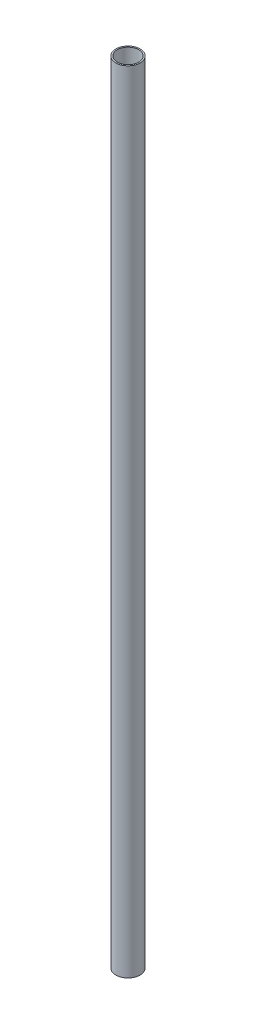
ISO-10303-21;
HEADER;
FILE_DESCRIPTION(('STEP AP214'),'2;1');
FILE_NAME('part.step','',(''),(''),'','','');
FILE_SCHEMA(('AUTOMOTIVE_DESIGN { 1 0 10303 214 1 1 1 1 }'));
ENDSEC;
DATA;
#1=APPLICATION_CONTEXT('core data for automotive mechanical design processes');
#2=APPLICATION_PROTOCOL_DEFINITION('international standard','automotive_design',2000,#1);
#3=PRODUCT_CONTEXT('',#1,'mechanical');
#4=PRODUCT('Part','Part','',(#3));
#5=PRODUCT_RELATED_PRODUCT_CATEGORY('part','',(#4));
#6=PRODUCT_DEFINITION_FORMATION('','',#4);
#7=PRODUCT_DEFINITION_CONTEXT('part definition',#1,'design');
#8=PRODUCT_DEFINITION('design','',#6,#7);
#9=PRODUCT_DEFINITION_SHAPE('','',#8);
#10=(LENGTH_UNIT() NAMED_UNIT(*) SI_UNIT(.MILLI.,.METRE.));
#11=(NAMED_UNIT(*) PLANE_ANGLE_UNIT() SI_UNIT($,.RADIAN.));
#12=(NAMED_UNIT(*) SI_UNIT($,.STERADIAN.) SOLID_ANGLE_UNIT());
#13=UNCERTAINTY_MEASURE_WITH_UNIT(LENGTH_MEASURE(1.E-05),#10,'distance_accuracy_value','');
#14=(GEOMETRIC_REPRESENTATION_CONTEXT(3) GLOBAL_UNCERTAINTY_ASSIGNED_CONTEXT((#13)) GLOBAL_UNIT_ASSIGNED_CONTEXT((#10,
#11,#12)) REPRESENTATION_CONTEXT('',''));
#15=CARTESIAN_POINT('',(0.,0.,0.));
#16=DIRECTION('',(0.,0.,1.));
#17=DIRECTION('',(1.,0.,0.));
#18=AXIS2_PLACEMENT_3D('',#15,#16,#17);
#19=CARTESIAN_POINT('',(0.,1300.,0.));
#20=DIRECTION('',(0.,1.,0.));
#21=DIRECTION('',(0.,0.,1.));
#22=AXIS2_PLACEMENT_3D('',#19,#20,#21);
#23=PLANE('',#22);
#24=CARTESIAN_POINT('',(0.,1300.,0.));
#25=DIRECTION('',(0.,1.,0.));
#26=DIRECTION('',(0.,0.,1.));
#27=AXIS2_PLACEMENT_3D('',#24,#25,#26);
#28=CIRCLE('',#27,20.);
#29=CARTESIAN_POINT('',(0.,1300.,20.));
#30=VERTEX_POINT('',#29);
#31=EDGE_CURVE('E10',#30,#30,#28,.T.);
#32=ORIENTED_EDGE('',*,*,#31,.T.);
#33=EDGE_LOOP('',(#32));
#34=FACE_BOUND('',#33,.T.);
#35=CARTESIAN_POINT('',(0.,1300.,0.));
#36=DIRECTION('',(0.,1.,0.));
#37=DIRECTION('',(0.,0.,1.));
#38=AXIS2_PLACEMENT_3D('',#35,#36,#37);
#39=CIRCLE('',#38,17.7);
#40=CARTESIAN_POINT('',(0.,1300.,17.7));
#41=VERTEX_POINT('',#40);
#42=EDGE_CURVE('E47',#41,#41,#39,.T.);
#43=ORIENTED_EDGE('',*,*,#42,.F.);
#44=EDGE_LOOP('',(#43));
#45=FACE_BOUND('',#44,.T.);
#46=ADVANCED_FACE('F36',(#34,#45),#23,.T.);
#47=CARTESIAN_POINT('',(0.,0.,0.));
#48=DIRECTION('',(0.,1.,0.));
#49=DIRECTION('',(0.,0.,1.));
#50=AXIS2_PLACEMENT_3D('',#47,#48,#49);
#51=PLANE('',#50);
#52=CARTESIAN_POINT('',(0.,0.,0.));
#53=DIRECTION('',(0.,1.,0.));
#54=DIRECTION('',(0.,0.,1.));
#55=AXIS2_PLACEMENT_3D('',#52,#53,#54);
#56=CIRCLE('',#55,20.);
#57=CARTESIAN_POINT('',(0.,0.,20.));
#58=VERTEX_POINT('',#57);
#59=EDGE_CURVE('E40',#58,#58,#56,.T.);
#60=ORIENTED_EDGE('',*,*,#59,.F.);
#61=EDGE_LOOP('',(#60));
#62=FACE_BOUND('',#61,.T.);
#63=CARTESIAN_POINT('',(0.,0.,0.));
#64=DIRECTION('',(0.,1.,0.));
#65=DIRECTION('',(0.,0.,1.));
#66=AXIS2_PLACEMENT_3D('',#63,#64,#65);
#67=CIRCLE('',#66,17.7);
#68=CARTESIAN_POINT('',(0.,0.,17.7));
#69=VERTEX_POINT('',#68);
#70=EDGE_CURVE('E49',#69,#69,#67,.T.);
#71=ORIENTED_EDGE('',*,*,#70,.T.);
#72=EDGE_LOOP('',(#71));
#73=FACE_BOUND('',#72,.T.);
#74=ADVANCED_FACE('F59',(#62,#73),#51,.F.);
#75=CARTESIAN_POINT('',(0.,1300.,0.));
#76=DIRECTION('',(0.,-1.,0.));
#77=DIRECTION('',(0.,0.,-1.));
#78=AXIS2_PLACEMENT_3D('',#75,#76,#77);
#79=CYLINDRICAL_SURFACE('',#78,20.);
#80=ORIENTED_EDGE('',*,*,#31,.F.);
#81=EDGE_LOOP('',(#80));
#82=FACE_BOUND('',#81,.T.);
#83=ORIENTED_EDGE('',*,*,#59,.T.);
#84=EDGE_LOOP('',(#83));
#85=FACE_BOUND('',#84,.T.);
#86=ADVANCED_FACE('F38',(#82,#85),#79,.T.);
#87=CARTESIAN_POINT('',(0.,1300.,0.));
#88=DIRECTION('',(0.,-1.,0.));
#89=DIRECTION('',(0.,0.,-1.));
#90=AXIS2_PLACEMENT_3D('',#87,#88,#89);
#91=CYLINDRICAL_SURFACE('',#90,17.7);
#92=ORIENTED_EDGE('',*,*,#42,.T.);
#93=EDGE_LOOP('',(#92));
#94=FACE_BOUND('',#93,.T.);
#95=ORIENTED_EDGE('',*,*,#70,.F.);
#96=EDGE_LOOP('',(#95));
#97=FACE_BOUND('',#96,.T.);
#98=ADVANCED_FACE('F55',(#94,#97),#91,.F.);
#99=CLOSED_SHELL('',(#46,#74,#86,#98));
#100=MANIFOLD_SOLID_BREP('B2',#99);
#101=ADVANCED_BREP_SHAPE_REPRESENTATION('',(#18,#100),#14);
#102=SHAPE_DEFINITION_REPRESENTATION(#9,#101);
ENDSEC;
END-ISO-10303-21;
